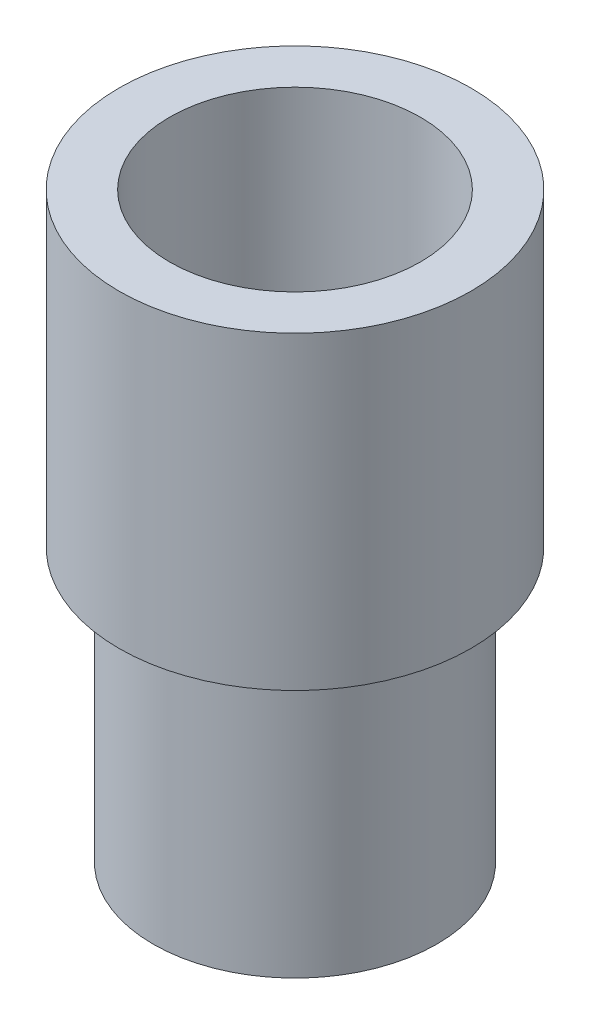
ISO-10303-21;
HEADER;
FILE_DESCRIPTION(('STEP AP214'),'2;1');
FILE_NAME('part.step','',(''),(''),'','','');
FILE_SCHEMA(('AUTOMOTIVE_DESIGN { 1 0 10303 214 1 1 1 1 }'));
ENDSEC;
DATA;
#1=APPLICATION_CONTEXT('core data for automotive mechanical design processes');
#2=APPLICATION_PROTOCOL_DEFINITION('international standard','automotive_design',2000,#1);
#3=PRODUCT_CONTEXT('',#1,'mechanical');
#4=PRODUCT('Part','Part','',(#3));
#5=PRODUCT_RELATED_PRODUCT_CATEGORY('part','',(#4));
#6=PRODUCT_DEFINITION_FORMATION('','',#4);
#7=PRODUCT_DEFINITION_CONTEXT('part definition',#1,'design');
#8=PRODUCT_DEFINITION('design','',#6,#7);
#9=PRODUCT_DEFINITION_SHAPE('','',#8);
#10=(LENGTH_UNIT() NAMED_UNIT(*) SI_UNIT(.MILLI.,.METRE.));
#11=(NAMED_UNIT(*) PLANE_ANGLE_UNIT() SI_UNIT($,.RADIAN.));
#12=(NAMED_UNIT(*) SI_UNIT($,.STERADIAN.) SOLID_ANGLE_UNIT());
#13=UNCERTAINTY_MEASURE_WITH_UNIT(LENGTH_MEASURE(1.E-05),#10,'distance_accuracy_value','');
#14=(GEOMETRIC_REPRESENTATION_CONTEXT(3) GLOBAL_UNCERTAINTY_ASSIGNED_CONTEXT((#13)) GLOBAL_UNIT_ASSIGNED_CONTEXT((#10,
#11,#12)) REPRESENTATION_CONTEXT('',''));
#15=CARTESIAN_POINT('',(0.,0.,0.));
#16=DIRECTION('',(0.,0.,1.));
#17=DIRECTION('',(1.,0.,0.));
#18=AXIS2_PLACEMENT_3D('',#15,#16,#17);
#19=CARTESIAN_POINT('',(0.,40.48,0.));
#20=DIRECTION('',(0.,1.,0.));
#21=DIRECTION('',(0.,0.,1.));
#22=AXIS2_PLACEMENT_3D('',#19,#20,#21);
#23=PLANE('',#22);
#24=CARTESIAN_POINT('',(0.,40.48,0.));
#25=DIRECTION('',(0.,-1.,0.));
#26=DIRECTION('',(0.,0.,-1.));
#27=AXIS2_PLACEMENT_3D('',#24,#25,#26);
#28=CIRCLE('',#27,13.9954);
#29=CARTESIAN_POINT('',(0.,40.48,-13.9954));
#30=VERTEX_POINT('',#29);
#31=EDGE_CURVE('E63',#30,#30,#28,.T.);
#32=ORIENTED_EDGE('',*,*,#31,.F.);
#33=EDGE_LOOP('',(#32));
#34=FACE_BOUND('',#33,.T.);
#35=ADVANCED_FACE('F35',(#34),#23,.T.);
#36=CARTESIAN_POINT('',(0.,30.48,0.));
#37=DIRECTION('',(0.,1.,0.));
#38=DIRECTION('',(0.,0.,1.));
#39=AXIS2_PLACEMENT_3D('',#36,#37,#38);
#40=PLANE('',#39);
#41=CARTESIAN_POINT('',(0.,30.48,0.));
#42=DIRECTION('',(0.,-1.,0.));
#43=DIRECTION('',(0.,0.,-1.));
#44=AXIS2_PLACEMENT_3D('',#41,#42,#43);
#45=CIRCLE('',#44,13.9954);
#46=CARTESIAN_POINT('',(0.,30.48,-13.9954));
#47=VERTEX_POINT('',#46);
#48=EDGE_CURVE('E10',#47,#47,#45,.T.);
#49=ORIENTED_EDGE('',*,*,#48,.T.);
#50=EDGE_LOOP('',(#49));
#51=FACE_BOUND('',#50,.T.);
#52=ADVANCED_FACE('F70',(#51),#40,.F.);
#53=CARTESIAN_POINT('',(0.,0.,0.));
#54=DIRECTION('',(0.,-1.,0.));
#55=DIRECTION('',(0.,0.,-1.));
#56=AXIS2_PLACEMENT_3D('',#53,#54,#55);
#57=CYLINDRICAL_SURFACE('',#56,13.9954);
#58=ORIENTED_EDGE('',*,*,#48,.F.);
#59=EDGE_LOOP('',(#58));
#60=FACE_BOUND('',#59,.T.);
#61=CARTESIAN_POINT('',(0.,0.,0.));
#62=DIRECTION('',(0.,-1.,0.));
#63=DIRECTION('',(0.,0.,-1.));
#64=AXIS2_PLACEMENT_3D('',#61,#62,#63);
#65=CIRCLE('',#64,13.9954);
#66=CARTESIAN_POINT('',(0.,0.,-13.9954));
#67=VERTEX_POINT('',#66);
#68=EDGE_CURVE('E41',#67,#67,#65,.T.);
#69=ORIENTED_EDGE('',*,*,#68,.T.);
#70=EDGE_LOOP('',(#69));
#71=FACE_BOUND('',#70,.T.);
#72=ADVANCED_FACE('F74',(#60,#71),#57,.F.);
#73=CARTESIAN_POINT('',(0.,0.,0.));
#74=DIRECTION('',(0.,-1.,0.));
#75=DIRECTION('',(0.,0.,-1.));
#76=AXIS2_PLACEMENT_3D('',#73,#74,#75);
#77=PLANE('',#76);
#78=CARTESIAN_POINT('',(0.,0.,0.));
#79=DIRECTION('',(0.,-1.,0.));
#80=DIRECTION('',(0.,0.,-1.));
#81=AXIS2_PLACEMENT_3D('',#78,#79,#80);
#82=CIRCLE('',#81,15.8242);
#83=CARTESIAN_POINT('',(0.,0.,-15.8242));
#84=VERTEX_POINT('',#83);
#85=EDGE_CURVE('E45',#84,#84,#82,.T.);
#86=ORIENTED_EDGE('',*,*,#85,.T.);
#87=EDGE_LOOP('',(#86));
#88=FACE_BOUND('',#87,.T.);
#89=ORIENTED_EDGE('',*,*,#68,.F.);
#90=EDGE_LOOP('',(#89));
#91=FACE_BOUND('',#90,.T.);
#92=ADVANCED_FACE('F78',(#88,#91),#77,.T.);
#93=CARTESIAN_POINT('',(0.,0.,0.));
#94=DIRECTION('',(0.,-1.,0.));
#95=DIRECTION('',(0.,0.,-1.));
#96=AXIS2_PLACEMENT_3D('',#93,#94,#95);
#97=CYLINDRICAL_SURFACE('',#96,15.8242);
#98=CARTESIAN_POINT('',(0.,30.48,0.));
#99=DIRECTION('',(0.,-1.,0.));
#100=DIRECTION('',(0.,0.,-1.));
#101=AXIS2_PLACEMENT_3D('',#98,#99,#100);
#102=CIRCLE('',#101,15.8242);
#103=CARTESIAN_POINT('',(0.,30.48,-15.8242));
#104=VERTEX_POINT('',#103);
#105=EDGE_CURVE('E49',#104,#104,#102,.T.);
#106=ORIENTED_EDGE('',*,*,#105,.T.);
#107=EDGE_LOOP('',(#106));
#108=FACE_BOUND('',#107,.T.);
#109=ORIENTED_EDGE('',*,*,#85,.F.);
#110=EDGE_LOOP('',(#109));
#111=FACE_BOUND('',#110,.T.);
#112=ADVANCED_FACE('F84',(#108,#111),#97,.T.);
#113=CARTESIAN_POINT('',(0.,30.48,0.));
#114=DIRECTION('',(0.,-1.,0.));
#115=DIRECTION('',(0.,0.,-1.));
#116=AXIS2_PLACEMENT_3D('',#113,#114,#115);
#117=PLANE('',#116);
#118=CARTESIAN_POINT('',(0.,30.48,0.));
#119=DIRECTION('',(0.,-1.,0.));
#120=DIRECTION('',(0.,0.,-1.));
#121=AXIS2_PLACEMENT_3D('',#118,#119,#120);
#122=CIRCLE('',#121,19.6342);
#123=CARTESIAN_POINT('',(0.,30.48,-19.6342));
#124=VERTEX_POINT('',#123);
#125=EDGE_CURVE('E54',#124,#124,#122,.T.);
#126=ORIENTED_EDGE('',*,*,#125,.T.);
#127=EDGE_LOOP('',(#126));
#128=FACE_BOUND('',#127,.T.);
#129=ORIENTED_EDGE('',*,*,#105,.F.);
#130=EDGE_LOOP('',(#129));
#131=FACE_BOUND('',#130,.T.);
#132=ADVANCED_FACE('F88',(#128,#131),#117,.T.);
#133=CARTESIAN_POINT('',(0.,0.,0.));
#134=DIRECTION('',(0.,-1.,0.));
#135=DIRECTION('',(0.,0.,-1.));
#136=AXIS2_PLACEMENT_3D('',#133,#134,#135);
#137=CYLINDRICAL_SURFACE('',#136,19.6342);
#138=CARTESIAN_POINT('',(0.,65.,0.));
#139=DIRECTION('',(0.,-1.,0.));
#140=DIRECTION('',(0.,0.,-1.));
#141=AXIS2_PLACEMENT_3D('',#138,#139,#140);
#142=CIRCLE('',#141,19.6342);
#143=CARTESIAN_POINT('',(0.,65.,-19.6342));
#144=VERTEX_POINT('',#143);
#145=EDGE_CURVE('E57',#144,#144,#142,.T.);
#146=ORIENTED_EDGE('',*,*,#145,.T.);
#147=EDGE_LOOP('',(#146));
#148=FACE_BOUND('',#147,.T.);
#149=ORIENTED_EDGE('',*,*,#125,.F.);
#150=EDGE_LOOP('',(#149));
#151=FACE_BOUND('',#150,.T.);
#152=ADVANCED_FACE('F92',(#148,#151),#137,.T.);
#153=CARTESIAN_POINT('',(0.,65.,0.));
#154=DIRECTION('',(0.,-1.,0.));
#155=DIRECTION('',(0.,0.,-1.));
#156=AXIS2_PLACEMENT_3D('',#153,#154,#155);
#157=PLANE('',#156);
#158=ORIENTED_EDGE('',*,*,#145,.F.);
#159=EDGE_LOOP('',(#158));
#160=FACE_BOUND('',#159,.T.);
#161=CARTESIAN_POINT('',(0.,65.,0.));
#162=DIRECTION('',(0.,-1.,0.));
#163=DIRECTION('',(0.,0.,-1.));
#164=AXIS2_PLACEMENT_3D('',#161,#162,#163);
#165=CIRCLE('',#164,13.9954);
#166=CARTESIAN_POINT('',(0.,65.,-13.9954));
#167=VERTEX_POINT('',#166);
#168=EDGE_CURVE('E60',#167,#167,#165,.T.);
#169=ORIENTED_EDGE('',*,*,#168,.T.);
#170=EDGE_LOOP('',(#169));
#171=FACE_BOUND('',#170,.T.);
#172=ADVANCED_FACE('F96',(#160,#171),#157,.F.);
#173=CARTESIAN_POINT('',(0.,0.,0.));
#174=DIRECTION('',(0.,-1.,0.));
#175=DIRECTION('',(0.,0.,-1.));
#176=AXIS2_PLACEMENT_3D('',#173,#174,#175);
#177=CYLINDRICAL_SURFACE('',#176,13.9954);
#178=ORIENTED_EDGE('',*,*,#168,.F.);
#179=EDGE_LOOP('',(#178));
#180=FACE_BOUND('',#179,.T.);
#181=ORIENTED_EDGE('',*,*,#31,.T.);
#182=EDGE_LOOP('',(#181));
#183=FACE_BOUND('',#182,.T.);
#184=ADVANCED_FACE('F67',(#180,#183),#177,.F.);
#185=CLOSED_SHELL('',(#35,#52,#72,#92,#112,#132,#152,#172,#184));
#186=MANIFOLD_SOLID_BREP('B2',#185);
#187=ADVANCED_BREP_SHAPE_REPRESENTATION('',(#18,#186),#14);
#188=SHAPE_DEFINITION_REPRESENTATION(#9,#187);
ENDSEC;
END-ISO-10303-21;
